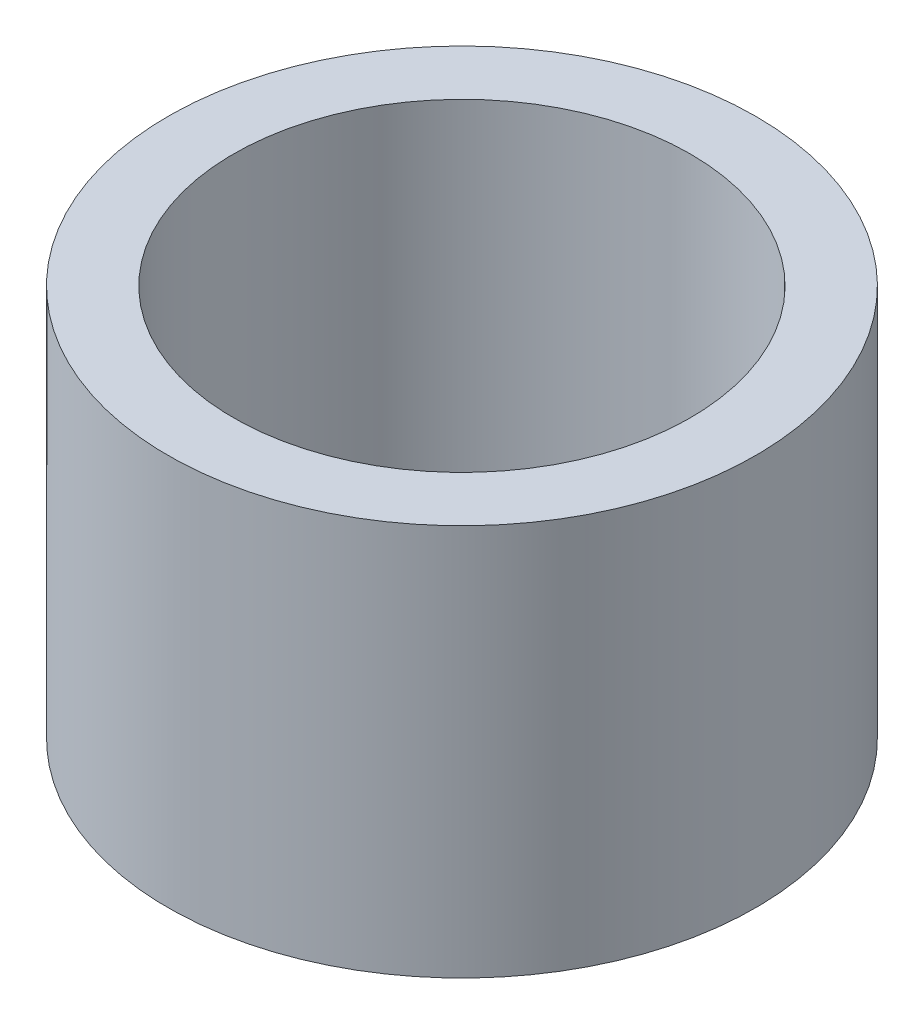
ISO-10303-21;
HEADER;
FILE_DESCRIPTION(('STEP AP214'),'2;1');
FILE_NAME('part.step','',(''),(''),'','','');
FILE_SCHEMA(('AUTOMOTIVE_DESIGN { 1 0 10303 214 1 1 1 1 }'));
ENDSEC;
DATA;
#1=APPLICATION_CONTEXT('core data for automotive mechanical design processes');
#2=APPLICATION_PROTOCOL_DEFINITION('international standard','automotive_design',2000,#1);
#3=PRODUCT_CONTEXT('',#1,'mechanical');
#4=PRODUCT('Part','Part','',(#3));
#5=PRODUCT_RELATED_PRODUCT_CATEGORY('part','',(#4));
#6=PRODUCT_DEFINITION_FORMATION('','',#4);
#7=PRODUCT_DEFINITION_CONTEXT('part definition',#1,'design');
#8=PRODUCT_DEFINITION('design','',#6,#7);
#9=PRODUCT_DEFINITION_SHAPE('','',#8);
#10=(LENGTH_UNIT() NAMED_UNIT(*) SI_UNIT(.MILLI.,.METRE.));
#11=(NAMED_UNIT(*) PLANE_ANGLE_UNIT() SI_UNIT($,.RADIAN.));
#12=(NAMED_UNIT(*) SI_UNIT($,.STERADIAN.) SOLID_ANGLE_UNIT());
#13=UNCERTAINTY_MEASURE_WITH_UNIT(LENGTH_MEASURE(1.E-05),#10,'distance_accuracy_value','');
#14=(GEOMETRIC_REPRESENTATION_CONTEXT(3) GLOBAL_UNCERTAINTY_ASSIGNED_CONTEXT((#13)) GLOBAL_UNIT_ASSIGNED_CONTEXT((#10,
#11,#12)) REPRESENTATION_CONTEXT('',''));
#15=CARTESIAN_POINT('',(0.,0.,0.));
#16=DIRECTION('',(0.,0.,1.));
#17=DIRECTION('',(1.,0.,0.));
#18=AXIS2_PLACEMENT_3D('',#15,#16,#17);
#19=CARTESIAN_POINT('',(0.,38.1,0.));
#20=DIRECTION('',(0.,1.,0.));
#21=DIRECTION('',(0.,0.,1.));
#22=AXIS2_PLACEMENT_3D('',#19,#20,#21);
#23=PLANE('',#22);
#24=CARTESIAN_POINT('',(0.,38.1,0.));
#25=DIRECTION('',(0.,1.,0.));
#26=DIRECTION('',(0.,0.,1.));
#27=AXIS2_PLACEMENT_3D('',#24,#25,#26);
#28=CIRCLE('',#27,28.575);
#29=CARTESIAN_POINT('',(0.,38.1,-28.575));
#30=VERTEX_POINT('',#29);
#31=EDGE_CURVE('E10',#30,#30,#28,.T.);
#32=ORIENTED_EDGE('',*,*,#31,.T.);
#33=EDGE_LOOP('',(#32));
#34=FACE_BOUND('',#33,.T.);
#35=CARTESIAN_POINT('',(0.,38.1,0.));
#36=DIRECTION('',(0.,1.,0.));
#37=DIRECTION('',(0.,0.,1.));
#38=AXIS2_PLACEMENT_3D('',#35,#36,#37);
#39=CIRCLE('',#38,22.225);
#40=CARTESIAN_POINT('',(0.,38.1,-22.225));
#41=VERTEX_POINT('',#40);
#42=EDGE_CURVE('E56',#41,#41,#39,.T.);
#43=ORIENTED_EDGE('',*,*,#42,.F.);
#44=EDGE_LOOP('',(#43));
#45=FACE_BOUND('',#44,.T.);
#46=ADVANCED_FACE('F43',(#34,#45),#23,.T.);
#47=CARTESIAN_POINT('',(0.,0.,0.));
#48=DIRECTION('',(0.,1.,0.));
#49=DIRECTION('',(0.,0.,1.));
#50=AXIS2_PLACEMENT_3D('',#47,#48,#49);
#51=PLANE('',#50);
#52=CARTESIAN_POINT('',(0.,0.,0.));
#53=DIRECTION('',(0.,1.,0.));
#54=DIRECTION('',(0.,0.,1.));
#55=AXIS2_PLACEMENT_3D('',#52,#53,#54);
#56=CIRCLE('',#55,28.575);
#57=CARTESIAN_POINT('',(0.,0.,-28.575));
#58=VERTEX_POINT('',#57);
#59=EDGE_CURVE('E47',#58,#58,#56,.T.);
#60=ORIENTED_EDGE('',*,*,#59,.F.);
#61=EDGE_LOOP('',(#60));
#62=FACE_BOUND('',#61,.T.);
#63=CARTESIAN_POINT('',(0.,0.,0.));
#64=DIRECTION('',(0.,1.,0.));
#65=DIRECTION('',(0.,0.,1.));
#66=AXIS2_PLACEMENT_3D('',#63,#64,#65);
#67=CIRCLE('',#66,22.225);
#68=CARTESIAN_POINT('',(0.,0.,-22.225));
#69=VERTEX_POINT('',#68);
#70=EDGE_CURVE('E58',#69,#69,#67,.T.);
#71=ORIENTED_EDGE('',*,*,#70,.T.);
#72=EDGE_LOOP('',(#71));
#73=FACE_BOUND('',#72,.T.);
#74=ADVANCED_FACE('F70',(#62,#73),#51,.F.);
#75=CARTESIAN_POINT('',(0.,38.1,0.));
#76=DIRECTION('',(0.,-1.,0.));
#77=DIRECTION('',(0.,0.,-1.));
#78=AXIS2_PLACEMENT_3D('',#75,#76,#77);
#79=CYLINDRICAL_SURFACE('',#78,28.575);
#80=CARTESIAN_POINT('',(0.,38.1,-28.575));
#81=CARTESIAN_POINT('',(0.,37.703125,-28.575));
#82=CARTESIAN_POINT('',(0.,37.30625,-28.575));
#83=CARTESIAN_POINT('',(0.,36.5125,-28.575));
#84=CARTESIAN_POINT('',(0.,36.115625,-28.575));
#85=CARTESIAN_POINT('',(0.,35.321875,-28.575));
#86=CARTESIAN_POINT('',(0.,34.925,-28.575));
#87=CARTESIAN_POINT('',(0.,34.13125,-28.575));
#88=CARTESIAN_POINT('',(0.,33.734375,-28.575));
#89=CARTESIAN_POINT('',(0.,32.940625,-28.575));
#90=CARTESIAN_POINT('',(0.,32.54375,-28.575));
#91=CARTESIAN_POINT('',(0.,31.75,-28.575));
#92=CARTESIAN_POINT('',(0.,31.353125,-28.575));
#93=CARTESIAN_POINT('',(0.,30.559375,-28.575));
#94=CARTESIAN_POINT('',(0.,30.1625,-28.575));
#95=CARTESIAN_POINT('',(0.,29.36875,-28.575));
#96=CARTESIAN_POINT('',(0.,28.971875,-28.575));
#97=CARTESIAN_POINT('',(0.,28.178125,-28.575));
#98=CARTESIAN_POINT('',(0.,27.78125,-28.575));
#99=CARTESIAN_POINT('',(0.,26.9875,-28.575));
#100=CARTESIAN_POINT('',(0.,26.590625,-28.575));
#101=CARTESIAN_POINT('',(0.,25.796875,-28.575));
#102=CARTESIAN_POINT('',(0.,25.4,-28.575));
#103=CARTESIAN_POINT('',(0.,24.60625,-28.575));
#104=CARTESIAN_POINT('',(0.,24.209375,-28.575));
#105=CARTESIAN_POINT('',(0.,23.415625,-28.575));
#106=CARTESIAN_POINT('',(0.,23.01875,-28.575));
#107=CARTESIAN_POINT('',(0.,22.225,-28.575));
#108=CARTESIAN_POINT('',(0.,21.828125,-28.575));
#109=CARTESIAN_POINT('',(0.,21.034375,-28.575));
#110=CARTESIAN_POINT('',(0.,20.6375,-28.575));
#111=CARTESIAN_POINT('',(0.,19.84375,-28.575));
#112=CARTESIAN_POINT('',(0.,19.446875,-28.575));
#113=CARTESIAN_POINT('',(0.,18.653125,-28.575));
#114=CARTESIAN_POINT('',(0.,18.25625,-28.575));
#115=CARTESIAN_POINT('',(0.,17.4625,-28.575));
#116=CARTESIAN_POINT('',(0.,17.065625,-28.575));
#117=CARTESIAN_POINT('',(0.,16.271875,-28.575));
#118=CARTESIAN_POINT('',(0.,15.875,-28.575));
#119=CARTESIAN_POINT('',(0.,15.08125,-28.575));
#120=CARTESIAN_POINT('',(0.,14.684375,-28.575));
#121=CARTESIAN_POINT('',(0.,13.890625,-28.575));
#122=CARTESIAN_POINT('',(0.,13.49375,-28.575));
#123=CARTESIAN_POINT('',(0.,12.7,-28.575));
#124=CARTESIAN_POINT('',(0.,12.303125,-28.575));
#125=CARTESIAN_POINT('',(0.,11.509375,-28.575));
#126=CARTESIAN_POINT('',(0.,11.1125,-28.575));
#127=CARTESIAN_POINT('',(0.,10.31875,-28.575));
#128=CARTESIAN_POINT('',(0.,9.92187499999999,-28.575));
#129=CARTESIAN_POINT('',(0.,9.128125,-28.575));
#130=CARTESIAN_POINT('',(0.,8.73124999999999,-28.575));
#131=CARTESIAN_POINT('',(0.,7.93749999999999,-28.575));
#132=CARTESIAN_POINT('',(0.,7.54062499999999,-28.575));
#133=CARTESIAN_POINT('',(0.,6.746875,-28.575));
#134=CARTESIAN_POINT('',(0.,6.35,-28.575));
#135=CARTESIAN_POINT('',(0.,5.55625,-28.575));
#136=CARTESIAN_POINT('',(0.,5.159375,-28.575));
#137=CARTESIAN_POINT('',(0.,4.365625,-28.575));
#138=CARTESIAN_POINT('',(0.,3.96875,-28.575));
#139=CARTESIAN_POINT('',(0.,3.175,-28.575));
#140=CARTESIAN_POINT('',(0.,2.778125,-28.575));
#141=CARTESIAN_POINT('',(0.,1.984375,-28.575));
#142=CARTESIAN_POINT('',(0.,1.5875,-28.575));
#143=CARTESIAN_POINT('',(0.,0.79375,-28.575));
#144=CARTESIAN_POINT('',(0.,0.396875,-28.575));
#145=CARTESIAN_POINT('',(0.,0.,-28.575));
#146=B_SPLINE_CURVE_WITH_KNOTS('',3,(#80,#81,#82,#83,#84,#85,#86,#87,#88,#89,#90,#91,#92,#93,
#94,#95,#96,#97,#98,#99,#100,#101,#102,#103,#104,#105,#106,#107,#108,#109,#110,#111,#112,#113,
#114,#115,#116,#117,#118,#119,#120,#121,#122,#123,#124,#125,#126,#127,#128,#129,#130,#131,#132,
#133,#134,#135,#136,#137,#138,#139,#140,#141,#142,#143,#144,#145),.UNSPECIFIED.,.F.,.F.,(4,2,2,
2,2,2,2,2,2,2,2,2,2,2,2,2,2,2,2,2,2,2,2,2,2,2,2,2,2,2,2,2,4),(0.,1.190625,2.38125,3.571875,
4.7625,5.953125,7.14375,8.334375,9.52500000000001,10.715625,11.90625,13.096875,14.2875,
15.478125,16.66875,17.859375,19.05,20.240625,21.43125,22.621875,23.8125,25.003125,26.19375,
27.384375,28.575,29.765625,30.95625,32.146875,33.3375,34.528125,35.71875,36.909375,38.1),.UNSPECIFIED.);
#147=EDGE_CURVE('BSEAM45',#30,#58,#146,.T.);
#148=ORIENTED_EDGE('',*,*,#31,.F.);
#149=ORIENTED_EDGE('',*,*,#59,.T.);
#150=ORIENTED_EDGE('',*,*,#147,.T.);
#151=ORIENTED_EDGE('',*,*,#147,.F.);
#152=EDGE_LOOP('',(#148,#150,#149,#151));
#153=FACE_BOUND('',#152,.T.);
#154=ADVANCED_FACE('F45',(#153),#79,.T.);
#155=CARTESIAN_POINT('',(0.,38.1,0.));
#156=DIRECTION('',(0.,-1.,0.));
#157=DIRECTION('',(0.,0.,-1.));
#158=AXIS2_PLACEMENT_3D('',#155,#156,#157);
#159=CYLINDRICAL_SURFACE('',#158,22.225);
#160=CARTESIAN_POINT('',(0.,38.1,-22.225));
#161=CARTESIAN_POINT('',(0.,37.703125,-22.225));
#162=CARTESIAN_POINT('',(0.,37.30625,-22.225));
#163=CARTESIAN_POINT('',(0.,36.5125,-22.225));
#164=CARTESIAN_POINT('',(0.,36.115625,-22.225));
#165=CARTESIAN_POINT('',(0.,35.321875,-22.225));
#166=CARTESIAN_POINT('',(0.,34.925,-22.225));
#167=CARTESIAN_POINT('',(0.,34.13125,-22.225));
#168=CARTESIAN_POINT('',(0.,33.734375,-22.225));
#169=CARTESIAN_POINT('',(0.,32.940625,-22.225));
#170=CARTESIAN_POINT('',(0.,32.54375,-22.225));
#171=CARTESIAN_POINT('',(0.,31.75,-22.225));
#172=CARTESIAN_POINT('',(0.,31.353125,-22.225));
#173=CARTESIAN_POINT('',(0.,30.559375,-22.225));
#174=CARTESIAN_POINT('',(0.,30.1625,-22.225));
#175=CARTESIAN_POINT('',(0.,29.36875,-22.225));
#176=CARTESIAN_POINT('',(0.,28.971875,-22.225));
#177=CARTESIAN_POINT('',(0.,28.178125,-22.225));
#178=CARTESIAN_POINT('',(0.,27.78125,-22.225));
#179=CARTESIAN_POINT('',(0.,26.9875,-22.225));
#180=CARTESIAN_POINT('',(0.,26.590625,-22.225));
#181=CARTESIAN_POINT('',(0.,25.796875,-22.225));
#182=CARTESIAN_POINT('',(0.,25.4,-22.225));
#183=CARTESIAN_POINT('',(0.,24.60625,-22.225));
#184=CARTESIAN_POINT('',(0.,24.209375,-22.225));
#185=CARTESIAN_POINT('',(0.,23.415625,-22.225));
#186=CARTESIAN_POINT('',(0.,23.01875,-22.225));
#187=CARTESIAN_POINT('',(0.,22.225,-22.225));
#188=CARTESIAN_POINT('',(0.,21.828125,-22.225));
#189=CARTESIAN_POINT('',(0.,21.034375,-22.225));
#190=CARTESIAN_POINT('',(0.,20.6375,-22.225));
#191=CARTESIAN_POINT('',(0.,19.84375,-22.225));
#192=CARTESIAN_POINT('',(0.,19.446875,-22.225));
#193=CARTESIAN_POINT('',(0.,18.653125,-22.225));
#194=CARTESIAN_POINT('',(0.,18.25625,-22.225));
#195=CARTESIAN_POINT('',(0.,17.4625,-22.225));
#196=CARTESIAN_POINT('',(0.,17.065625,-22.225));
#197=CARTESIAN_POINT('',(0.,16.271875,-22.225));
#198=CARTESIAN_POINT('',(0.,15.875,-22.225));
#199=CARTESIAN_POINT('',(0.,15.08125,-22.225));
#200=CARTESIAN_POINT('',(0.,14.684375,-22.225));
#201=CARTESIAN_POINT('',(0.,13.890625,-22.225));
#202=CARTESIAN_POINT('',(0.,13.49375,-22.225));
#203=CARTESIAN_POINT('',(0.,12.7,-22.225));
#204=CARTESIAN_POINT('',(0.,12.303125,-22.225));
#205=CARTESIAN_POINT('',(0.,11.509375,-22.225));
#206=CARTESIAN_POINT('',(0.,11.1125,-22.225));
#207=CARTESIAN_POINT('',(0.,10.31875,-22.225));
#208=CARTESIAN_POINT('',(0.,9.92187499999999,-22.225));
#209=CARTESIAN_POINT('',(0.,9.128125,-22.225));
#210=CARTESIAN_POINT('',(0.,8.73124999999999,-22.225));
#211=CARTESIAN_POINT('',(0.,7.93749999999999,-22.225));
#212=CARTESIAN_POINT('',(0.,7.54062499999999,-22.225));
#213=CARTESIAN_POINT('',(0.,6.746875,-22.225));
#214=CARTESIAN_POINT('',(0.,6.35,-22.225));
#215=CARTESIAN_POINT('',(0.,5.55625,-22.225));
#216=CARTESIAN_POINT('',(0.,5.159375,-22.225));
#217=CARTESIAN_POINT('',(0.,4.365625,-22.225));
#218=CARTESIAN_POINT('',(0.,3.96875,-22.225));
#219=CARTESIAN_POINT('',(0.,3.175,-22.225));
#220=CARTESIAN_POINT('',(0.,2.778125,-22.225));
#221=CARTESIAN_POINT('',(0.,1.984375,-22.225));
#222=CARTESIAN_POINT('',(0.,1.5875,-22.225));
#223=CARTESIAN_POINT('',(0.,0.79375,-22.225));
#224=CARTESIAN_POINT('',(0.,0.396875,-22.225));
#225=CARTESIAN_POINT('',(0.,0.,-22.225));
#226=B_SPLINE_CURVE_WITH_KNOTS('',3,(#160,#161,#162,#163,#164,#165,#166,#167,#168,#169,#170,
#171,#172,#173,#174,#175,#176,#177,#178,#179,#180,#181,#182,#183,#184,#185,#186,#187,#188,#189,
#190,#191,#192,#193,#194,#195,#196,#197,#198,#199,#200,#201,#202,#203,#204,#205,#206,#207,#208,
#209,#210,#211,#212,#213,#214,#215,#216,#217,#218,#219,#220,#221,#222,#223,#224,#225),
.UNSPECIFIED.,.F.,.F.,(4,2,2,2,2,2,2,2,2,2,2,2,2,2,2,2,2,2,2,2,2,2,2,2,2,2,2,2,2,2,2,2,4),(0.,
1.190625,2.38125,3.571875,4.7625,5.953125,7.14375,8.334375,9.52500000000001,10.715625,11.90625,
13.096875,14.2875,15.478125,16.66875,17.859375,19.05,20.240625,21.43125,22.621875,23.8125,
25.003125,26.19375,27.384375,28.575,29.765625,30.95625,32.146875,33.3375,34.528125,35.71875,
36.909375,38.1),.UNSPECIFIED.);
#227=EDGE_CURVE('BSEAM66',#41,#69,#226,.T.);
#228=ORIENTED_EDGE('',*,*,#42,.T.);
#229=ORIENTED_EDGE('',*,*,#70,.F.);
#230=ORIENTED_EDGE('',*,*,#227,.T.);
#231=ORIENTED_EDGE('',*,*,#227,.F.);
#232=EDGE_LOOP('',(#228,#230,#229,#231));
#233=FACE_BOUND('',#232,.T.);
#234=ADVANCED_FACE('F66',(#233),#159,.F.);
#235=CLOSED_SHELL('',(#46,#74,#154,#234));
#236=MANIFOLD_SOLID_BREP('B2',#235);
#237=ADVANCED_BREP_SHAPE_REPRESENTATION('',(#18,#236),#14);
#238=SHAPE_DEFINITION_REPRESENTATION(#9,#237);
ENDSEC;
END-ISO-10303-21;
